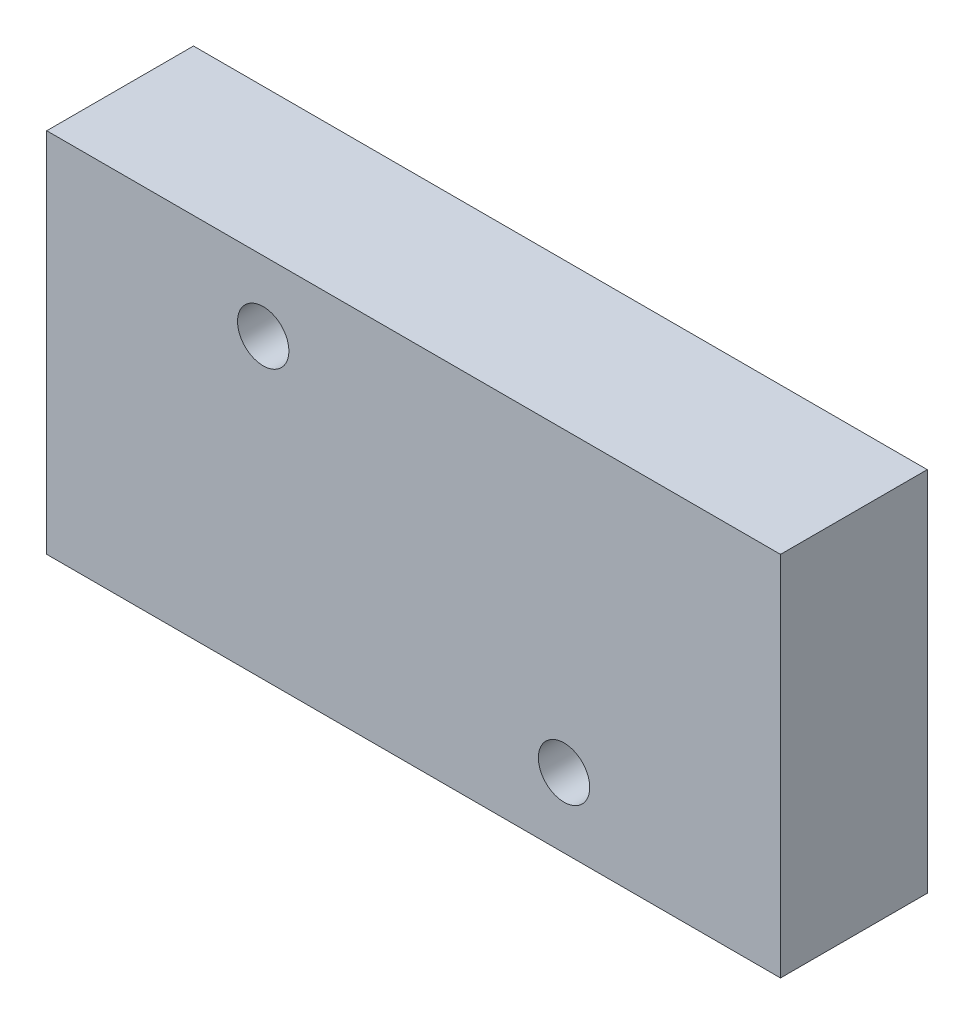
ISO-10303-21;
HEADER;
FILE_DESCRIPTION(('STEP AP214'),'2;1');
FILE_NAME('part.step','',(''),(''),'','','');
FILE_SCHEMA(('AUTOMOTIVE_DESIGN { 1 0 10303 214 1 1 1 1 }'));
ENDSEC;
DATA;
#1=APPLICATION_CONTEXT('core data for automotive mechanical design processes');
#2=APPLICATION_PROTOCOL_DEFINITION('international standard','automotive_design',2000,#1);
#3=PRODUCT_CONTEXT('',#1,'mechanical');
#4=PRODUCT('Part','Part','',(#3));
#5=PRODUCT_RELATED_PRODUCT_CATEGORY('part','',(#4));
#6=PRODUCT_DEFINITION_FORMATION('','',#4);
#7=PRODUCT_DEFINITION_CONTEXT('part definition',#1,'design');
#8=PRODUCT_DEFINITION('design','',#6,#7);
#9=PRODUCT_DEFINITION_SHAPE('','',#8);
#10=(LENGTH_UNIT() NAMED_UNIT(*) SI_UNIT(.MILLI.,.METRE.));
#11=(NAMED_UNIT(*) PLANE_ANGLE_UNIT() SI_UNIT($,.RADIAN.));
#12=(NAMED_UNIT(*) SI_UNIT($,.STERADIAN.) SOLID_ANGLE_UNIT());
#13=UNCERTAINTY_MEASURE_WITH_UNIT(LENGTH_MEASURE(1.E-05),#10,'distance_accuracy_value','');
#14=(GEOMETRIC_REPRESENTATION_CONTEXT(3) GLOBAL_UNCERTAINTY_ASSIGNED_CONTEXT((#13)) GLOBAL_UNIT_ASSIGNED_CONTEXT((#10,
#11,#12)) REPRESENTATION_CONTEXT('',''));
#15=CARTESIAN_POINT('',(0.,0.,0.));
#16=DIRECTION('',(0.,0.,1.));
#17=DIRECTION('',(1.,0.,0.));
#18=AXIS2_PLACEMENT_3D('',#15,#16,#17);
#19=CARTESIAN_POINT('',(-31.6279069767442,18.3139534883721,10.));
#20=DIRECTION('',(1.,0.,0.));
#21=DIRECTION('',(0.,1.,0.));
#22=AXIS2_PLACEMENT_3D('',#19,#20,#21);
#23=PLANE('',#22);
#24=DIRECTION('',(0.,-1.,0.));
#25=VECTOR('',#24,1.);
#26=CARTESIAN_POINT('',(-31.6279069767442,18.3139534883721,0.));
#27=LINE('',#26,#25);
#28=CARTESIAN_POINT('',(-31.6279069767442,18.3139534883721,0.));
#29=VERTEX_POINT('',#28);
#30=CARTESIAN_POINT('',(-31.6279069767442,-6.68604651162791,0.));
#31=VERTEX_POINT('',#30);
#32=EDGE_CURVE('E96',#29,#31,#27,.T.);
#33=ORIENTED_EDGE('',*,*,#32,.T.);
#34=DIRECTION('',(0.,0.,-1.));
#35=VECTOR('',#34,1.);
#36=CARTESIAN_POINT('',(-31.6279069767442,-6.68604651162791,10.));
#37=LINE('',#36,#35);
#38=CARTESIAN_POINT('',(-31.6279069767442,-6.68604651162791,10.));
#39=VERTEX_POINT('',#38);
#40=EDGE_CURVE('E11',#39,#31,#37,.T.);
#41=ORIENTED_EDGE('',*,*,#40,.F.);
#42=DIRECTION('',(0.,-1.,0.));
#43=VECTOR('',#42,1.);
#44=CARTESIAN_POINT('',(-31.6279069767442,18.3139534883721,10.));
#45=LINE('',#44,#43);
#46=CARTESIAN_POINT('',(-31.6279069767442,18.3139534883721,10.));
#47=VERTEX_POINT('',#46);
#48=EDGE_CURVE('E84',#47,#39,#45,.T.);
#49=ORIENTED_EDGE('',*,*,#48,.F.);
#50=DIRECTION('',(0.,0.,-1.));
#51=VECTOR('',#50,1.);
#52=CARTESIAN_POINT('',(-31.6279069767442,18.3139534883721,10.));
#53=LINE('',#52,#51);
#54=EDGE_CURVE('E92',#47,#29,#53,.T.);
#55=ORIENTED_EDGE('',*,*,#54,.T.);
#56=EDGE_LOOP('',(#33,#41,#49,#55));
#57=FACE_BOUND('',#56,.T.);
#58=ADVANCED_FACE('F33',(#57),#23,.F.);
#59=CARTESIAN_POINT('',(-31.6279069767442,-6.68604651162791,10.));
#60=DIRECTION('',(0.,1.,0.));
#61=DIRECTION('',(0.,0.,1.));
#62=AXIS2_PLACEMENT_3D('',#59,#60,#61);
#63=PLANE('',#62);
#64=DIRECTION('',(1.,0.,0.));
#65=VECTOR('',#64,1.);
#66=CARTESIAN_POINT('',(-31.6279069767442,-6.68604651162791,0.));
#67=LINE('',#66,#65);
#68=CARTESIAN_POINT('',(18.3720930232558,-6.68604651162791,0.));
#69=VERTEX_POINT('',#68);
#70=EDGE_CURVE('E88',#31,#69,#67,.T.);
#71=ORIENTED_EDGE('',*,*,#70,.T.);
#72=DIRECTION('',(0.,0.,-1.));
#73=VECTOR('',#72,1.);
#74=CARTESIAN_POINT('',(18.3720930232558,-6.68604651162791,10.));
#75=LINE('',#74,#73);
#76=CARTESIAN_POINT('',(18.3720930232558,-6.68604651162791,10.));
#77=VERTEX_POINT('',#76);
#78=EDGE_CURVE('E41',#77,#69,#75,.T.);
#79=ORIENTED_EDGE('',*,*,#78,.F.);
#80=DIRECTION('',(1.,0.,0.));
#81=VECTOR('',#80,1.);
#82=CARTESIAN_POINT('',(-31.6279069767442,-6.68604651162791,10.));
#83=LINE('',#82,#81);
#84=EDGE_CURVE('E79',#39,#77,#83,.T.);
#85=ORIENTED_EDGE('',*,*,#84,.F.);
#86=ORIENTED_EDGE('',*,*,#40,.T.);
#87=EDGE_LOOP('',(#71,#79,#85,#86));
#88=FACE_BOUND('',#87,.T.);
#89=ADVANCED_FACE('F87',(#88),#63,.F.);
#90=CARTESIAN_POINT('',(18.3720930232558,18.3139534883721,10.));
#91=DIRECTION('',(-1.,0.,0.));
#92=DIRECTION('',(0.,0.,1.));
#93=AXIS2_PLACEMENT_3D('',#90,#91,#92);
#94=PLANE('',#93);
#95=DIRECTION('',(0.,1.,0.));
#96=VECTOR('',#95,1.);
#97=CARTESIAN_POINT('',(18.3720930232558,18.3139534883721,0.));
#98=LINE('',#97,#96);
#99=CARTESIAN_POINT('',(18.3720930232558,18.3139534883721,0.));
#100=VERTEX_POINT('',#99);
#101=EDGE_CURVE('E66',#69,#100,#98,.T.);
#102=ORIENTED_EDGE('',*,*,#101,.T.);
#103=DIRECTION('',(0.,0.,-1.));
#104=VECTOR('',#103,1.);
#105=CARTESIAN_POINT('',(18.3720930232558,18.3139534883721,10.));
#106=LINE('',#105,#104);
#107=CARTESIAN_POINT('',(18.3720930232558,18.3139534883721,10.));
#108=VERTEX_POINT('',#107);
#109=EDGE_CURVE('E89',#108,#100,#106,.T.);
#110=ORIENTED_EDGE('',*,*,#109,.F.);
#111=DIRECTION('',(0.,1.,0.));
#112=VECTOR('',#111,1.);
#113=CARTESIAN_POINT('',(18.3720930232558,18.3139534883721,10.));
#114=LINE('',#113,#112);
#115=EDGE_CURVE('E82',#77,#108,#114,.T.);
#116=ORIENTED_EDGE('',*,*,#115,.F.);
#117=ORIENTED_EDGE('',*,*,#78,.T.);
#118=EDGE_LOOP('',(#102,#110,#116,#117));
#119=FACE_BOUND('',#118,.T.);
#120=ADVANCED_FACE('F90',(#119),#94,.F.);
#121=CARTESIAN_POINT('',(-31.6279069767442,18.3139534883721,10.));
#122=DIRECTION('',(0.,-1.,0.));
#123=DIRECTION('',(0.,0.,-1.));
#124=AXIS2_PLACEMENT_3D('',#121,#122,#123);
#125=PLANE('',#124);
#126=DIRECTION('',(-1.,0.,0.));
#127=VECTOR('',#126,1.);
#128=CARTESIAN_POINT('',(-31.6279069767442,18.3139534883721,0.));
#129=LINE('',#128,#127);
#130=EDGE_CURVE('E72',#100,#29,#129,.T.);
#131=ORIENTED_EDGE('',*,*,#130,.T.);
#132=ORIENTED_EDGE('',*,*,#54,.F.);
#133=DIRECTION('',(-1.,0.,0.));
#134=VECTOR('',#133,1.);
#135=CARTESIAN_POINT('',(-31.6279069767442,18.3139534883721,10.));
#136=LINE('',#135,#134);
#137=EDGE_CURVE('E49',#108,#47,#136,.T.);
#138=ORIENTED_EDGE('',*,*,#137,.F.);
#139=ORIENTED_EDGE('',*,*,#109,.T.);
#140=EDGE_LOOP('',(#131,#132,#138,#139));
#141=FACE_BOUND('',#140,.T.);
#142=ADVANCED_FACE('F104',(#141),#125,.F.);
#143=CARTESIAN_POINT('',(0.,0.,10.));
#144=DIRECTION('',(0.,0.,1.));
#145=DIRECTION('',(1.,0.,0.));
#146=AXIS2_PLACEMENT_3D('',#143,#144,#145);
#147=PLANE('',#146);
#148=CARTESIAN_POINT('',(3.62209302325583,-1.93604651162791,10.));
#149=DIRECTION('',(0.,0.,1.));
#150=DIRECTION('',(1.,0.,0.));
#151=AXIS2_PLACEMENT_3D('',#148,#149,#150);
#152=CIRCLE('',#151,1.75);
#153=CARTESIAN_POINT('',(5.37209302325583,-1.93604651162791,10.));
#154=VERTEX_POINT('',#153);
#155=EDGE_CURVE('E116',#154,#154,#152,.T.);
#156=ORIENTED_EDGE('',*,*,#155,.F.);
#157=EDGE_LOOP('',(#156));
#158=FACE_BOUND('',#157,.T.);
#159=CARTESIAN_POINT('',(-16.8779069767442,13.5639534883721,10.));
#160=DIRECTION('',(0.,0.,1.));
#161=DIRECTION('',(1.,0.,0.));
#162=AXIS2_PLACEMENT_3D('',#159,#160,#161);
#163=CIRCLE('',#162,1.75);
#164=CARTESIAN_POINT('',(-15.1279069767442,13.5639534883721,10.));
#165=VERTEX_POINT('',#164);
#166=EDGE_CURVE('E110',#165,#165,#163,.T.);
#167=ORIENTED_EDGE('',*,*,#166,.F.);
#168=EDGE_LOOP('',(#167));
#169=FACE_BOUND('',#168,.T.);
#170=ORIENTED_EDGE('',*,*,#48,.T.);
#171=ORIENTED_EDGE('',*,*,#84,.T.);
#172=ORIENTED_EDGE('',*,*,#115,.T.);
#173=ORIENTED_EDGE('',*,*,#137,.T.);
#174=EDGE_LOOP('',(#170,#171,#172,#173));
#175=FACE_BOUND('',#174,.T.);
#176=ADVANCED_FACE('F80',(#158,#169,#175),#147,.T.);
#177=CARTESIAN_POINT('',(0.,0.,0.));
#178=DIRECTION('',(0.,0.,1.));
#179=DIRECTION('',(1.,0.,0.));
#180=AXIS2_PLACEMENT_3D('',#177,#178,#179);
#181=PLANE('',#180);
#182=CARTESIAN_POINT('',(3.62209302325583,-1.93604651162791,0.));
#183=DIRECTION('',(0.,0.,1.));
#184=DIRECTION('',(1.,0.,0.));
#185=AXIS2_PLACEMENT_3D('',#182,#183,#184);
#186=CIRCLE('',#185,1.75);
#187=CARTESIAN_POINT('',(5.37209302325583,-1.93604651162791,0.));
#188=VERTEX_POINT('',#187);
#189=EDGE_CURVE('E113',#188,#188,#186,.T.);
#190=ORIENTED_EDGE('',*,*,#189,.T.);
#191=EDGE_LOOP('',(#190));
#192=FACE_BOUND('',#191,.T.);
#193=CARTESIAN_POINT('',(-16.8779069767442,13.5639534883721,0.));
#194=DIRECTION('',(0.,0.,1.));
#195=DIRECTION('',(1.,0.,0.));
#196=AXIS2_PLACEMENT_3D('',#193,#194,#195);
#197=CIRCLE('',#196,1.75);
#198=CARTESIAN_POINT('',(-15.1279069767442,13.5639534883721,0.));
#199=VERTEX_POINT('',#198);
#200=EDGE_CURVE('E99',#199,#199,#197,.T.);
#201=ORIENTED_EDGE('',*,*,#200,.T.);
#202=EDGE_LOOP('',(#201));
#203=FACE_BOUND('',#202,.T.);
#204=ORIENTED_EDGE('',*,*,#32,.F.);
#205=ORIENTED_EDGE('',*,*,#130,.F.);
#206=ORIENTED_EDGE('',*,*,#101,.F.);
#207=ORIENTED_EDGE('',*,*,#70,.F.);
#208=EDGE_LOOP('',(#204,#205,#206,#207));
#209=FACE_BOUND('',#208,.T.);
#210=ADVANCED_FACE('F107',(#192,#203,#209),#181,.F.);
#211=CARTESIAN_POINT('',(-16.8779069767442,13.5639534883721,0.));
#212=DIRECTION('',(0.,0.,1.));
#213=DIRECTION('',(1.,0.,0.));
#214=AXIS2_PLACEMENT_3D('',#211,#212,#213);
#215=CYLINDRICAL_SURFACE('',#214,1.75);
#216=ORIENTED_EDGE('',*,*,#200,.F.);
#217=EDGE_LOOP('',(#216));
#218=FACE_BOUND('',#217,.T.);
#219=ORIENTED_EDGE('',*,*,#166,.T.);
#220=EDGE_LOOP('',(#219));
#221=FACE_BOUND('',#220,.T.);
#222=ADVANCED_FACE('F127',(#218,#221),#215,.F.);
#223=CARTESIAN_POINT('',(3.62209302325583,-1.93604651162791,0.));
#224=DIRECTION('',(0.,0.,1.));
#225=DIRECTION('',(1.,0.,0.));
#226=AXIS2_PLACEMENT_3D('',#223,#224,#225);
#227=CYLINDRICAL_SURFACE('',#226,1.75);
#228=ORIENTED_EDGE('',*,*,#189,.F.);
#229=EDGE_LOOP('',(#228));
#230=FACE_BOUND('',#229,.T.);
#231=ORIENTED_EDGE('',*,*,#155,.T.);
#232=EDGE_LOOP('',(#231));
#233=FACE_BOUND('',#232,.T.);
#234=ADVANCED_FACE('F124',(#230,#233),#227,.F.);
#235=CLOSED_SHELL('',(#58,#89,#120,#142,#176,#210,#222,#234));
#236=MANIFOLD_SOLID_BREP('B2',#235);
#237=ADVANCED_BREP_SHAPE_REPRESENTATION('',(#18,#236),#14);
#238=SHAPE_DEFINITION_REPRESENTATION(#9,#237);
ENDSEC;
END-ISO-10303-21;
